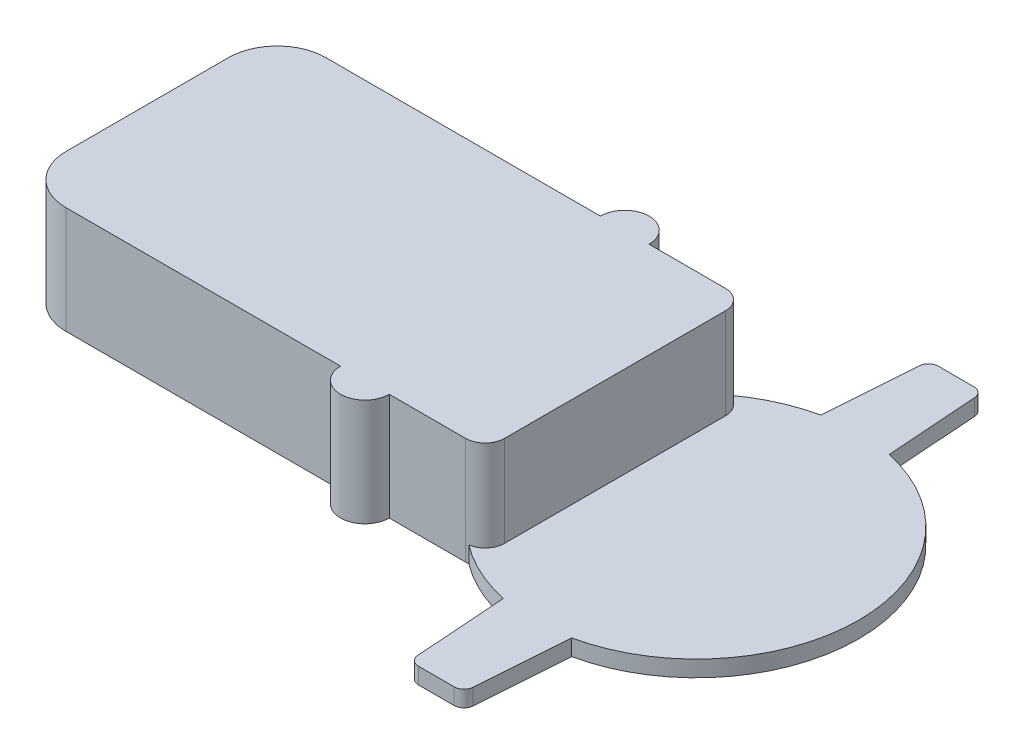
ISO-10303-21;
HEADER;
FILE_DESCRIPTION(('STEP AP214'),'2;1');
FILE_NAME('part.step','',(''),(''),'','','');
FILE_SCHEMA(('AUTOMOTIVE_DESIGN { 1 0 10303 214 1 1 1 1 }'));
ENDSEC;
DATA;
#1=APPLICATION_CONTEXT('core data for automotive mechanical design processes');
#2=APPLICATION_PROTOCOL_DEFINITION('international standard','automotive_design',2000,#1);
#3=PRODUCT_CONTEXT('',#1,'mechanical');
#4=PRODUCT('Part','Part','',(#3));
#5=PRODUCT_RELATED_PRODUCT_CATEGORY('part','',(#4));
#6=PRODUCT_DEFINITION_FORMATION('','',#4);
#7=PRODUCT_DEFINITION_CONTEXT('part definition',#1,'design');
#8=PRODUCT_DEFINITION('design','',#6,#7);
#9=PRODUCT_DEFINITION_SHAPE('','',#8);
#10=(LENGTH_UNIT() NAMED_UNIT(*) SI_UNIT(.MILLI.,.METRE.));
#11=(NAMED_UNIT(*) PLANE_ANGLE_UNIT() SI_UNIT($,.RADIAN.));
#12=(NAMED_UNIT(*) SI_UNIT($,.STERADIAN.) SOLID_ANGLE_UNIT());
#13=UNCERTAINTY_MEASURE_WITH_UNIT(LENGTH_MEASURE(1.E-05),#10,'distance_accuracy_value','');
#14=(GEOMETRIC_REPRESENTATION_CONTEXT(3) GLOBAL_UNCERTAINTY_ASSIGNED_CONTEXT((#13)) GLOBAL_UNIT_ASSIGNED_CONTEXT((#10,
#11,#12)) REPRESENTATION_CONTEXT('',''));
#15=CARTESIAN_POINT('',(0.,0.,0.));
#16=DIRECTION('',(0.,0.,1.));
#17=DIRECTION('',(1.,0.,0.));
#18=AXIS2_PLACEMENT_3D('',#15,#16,#17);
#19=CARTESIAN_POINT('',(0.,5.,0.));
#20=DIRECTION('',(0.,-1.,0.));
#21=DIRECTION('',(0.,0.,-1.));
#22=AXIS2_PLACEMENT_3D('',#19,#20,#21);
#23=CYLINDRICAL_SURFACE('',#22,50.);
#24=DIRECTION('',(0.,-1.,0.));
#25=VECTOR('',#24,1.);
#26=CARTESIAN_POINT('',(-30.0919312602184,2.5,39.9308862039185));
#27=LINE('',#26,#25);
#28=CARTESIAN_POINT('',(-30.0919312602184,0.,39.9308862039185));
#29=VERTEX_POINT('',#28);
#30=CARTESIAN_POINT('',(-30.0919312602184,5.,39.9308862039185));
#31=VERTEX_POINT('',#30);
#32=EDGE_CURVE('E313',#29,#31,#27,.F.);
#33=ORIENTED_EDGE('',*,*,#32,.F.);
#34=CARTESIAN_POINT('',(0.,0.,0.));
#35=DIRECTION('',(0.,1.,0.));
#36=DIRECTION('',(0.,0.,1.));
#37=AXIS2_PLACEMENT_3D('',#34,#35,#36);
#38=CIRCLE('',#37,50.);
#39=CARTESIAN_POINT('',(-10.5,0.,48.8850692952357));
#40=VERTEX_POINT('',#39);
#41=EDGE_CURVE('E182',#29,#40,#38,.T.);
#42=ORIENTED_EDGE('',*,*,#41,.T.);
#43=DIRECTION('',(0.,-1.,0.));
#44=VECTOR('',#43,1.);
#45=CARTESIAN_POINT('',(-10.5,5.,48.8850692952357));
#46=LINE('',#45,#44);
#47=CARTESIAN_POINT('',(-10.5,5.,48.8850692952357));
#48=VERTEX_POINT('',#47);
#49=EDGE_CURVE('E11',#48,#40,#46,.T.);
#50=ORIENTED_EDGE('',*,*,#49,.F.);
#51=CARTESIAN_POINT('',(0.,5.,0.));
#52=DIRECTION('',(0.,1.,0.));
#53=DIRECTION('',(0.,0.,1.));
#54=AXIS2_PLACEMENT_3D('',#51,#52,#53);
#55=CIRCLE('',#54,50.);
#56=EDGE_CURVE('E116',#31,#48,#55,.T.);
#57=ORIENTED_EDGE('',*,*,#56,.F.);
#58=EDGE_LOOP('',(#33,#42,#50,#57));
#59=FACE_BOUND('',#58,.T.);
#60=ADVANCED_FACE('F39',(#59),#23,.T.);
#61=DIRECTION('',(0.,-1.,0.));
#62=VECTOR('',#61,1.);
#63=CARTESIAN_POINT('',(-30.0919312602184,2.5,-39.9308862039185));
#64=LINE('',#63,#62);
#65=CARTESIAN_POINT('',(-30.0919312602184,5.,-39.9308862039185));
#66=VERTEX_POINT('',#65);
#67=CARTESIAN_POINT('',(-30.0919312602184,0.,-39.9308862039185));
#68=VERTEX_POINT('',#67);
#69=EDGE_CURVE('E304',#66,#68,#64,.T.);
#70=ORIENTED_EDGE('',*,*,#69,.F.);
#71=CARTESIAN_POINT('',(-10.5,5.,-48.8850692952357));
#72=VERTEX_POINT('',#71);
#73=EDGE_CURVE('E300',#72,#66,#55,.T.);
#74=ORIENTED_EDGE('',*,*,#73,.F.);
#75=DIRECTION('',(0.,-1.,0.));
#76=VECTOR('',#75,1.);
#77=CARTESIAN_POINT('',(-10.5,5.,-48.8850692952357));
#78=LINE('',#77,#76);
#79=CARTESIAN_POINT('',(-10.5,0.,-48.8850692952357));
#80=VERTEX_POINT('',#79);
#81=EDGE_CURVE('E173',#72,#80,#78,.T.);
#82=ORIENTED_EDGE('',*,*,#81,.T.);
#83=EDGE_CURVE('E177',#80,#68,#38,.T.);
#84=ORIENTED_EDGE('',*,*,#83,.T.);
#85=EDGE_LOOP('',(#70,#74,#82,#84));
#86=FACE_BOUND('',#85,.T.);
#87=ADVANCED_FACE('F301',(#86),#23,.T.);
#88=CARTESIAN_POINT('',(-10.5,5.,48.8850692952357));
#89=DIRECTION('',(0.997516680584559,0.,-0.0704306180262745));
#90=DIRECTION('',(-0.0704306180262745,0.,-0.997516680584559));
#91=AXIS2_PLACEMENT_3D('',#88,#89,#90);
#92=PLANE('',#91);
#93=DIRECTION('',(0.0704306180262745,0.,0.997516680584559));
#94=VECTOR('',#93,1.);
#95=CARTESIAN_POINT('',(-10.5,0.,48.8850692952357));
#96=LINE('',#95,#94);
#97=CARTESIAN_POINT('',(-8.49999999999999,0.,77.2112918540788));
#98=VERTEX_POINT('',#97);
#99=EDGE_CURVE('E181',#40,#98,#96,.T.);
#100=ORIENTED_EDGE('',*,*,#99,.T.);
#101=DIRECTION('',(0.,-1.,0.));
#102=VECTOR('',#101,1.);
#103=CARTESIAN_POINT('',(-8.49999999999999,5.,77.2112918540788));
#104=LINE('',#103,#102);
#105=CARTESIAN_POINT('',(-8.49999999999999,5.,77.2112918540788));
#106=VERTEX_POINT('',#105);
#107=EDGE_CURVE('E47',#106,#98,#104,.T.);
#108=ORIENTED_EDGE('',*,*,#107,.F.);
#109=DIRECTION('',(0.0704306180262745,0.,0.997516680584559));
#110=VECTOR('',#109,1.);
#111=CARTESIAN_POINT('',(-10.5,5.,48.8850692952357));
#112=LINE('',#111,#110);
#113=EDGE_CURVE('E307',#48,#106,#112,.T.);
#114=ORIENTED_EDGE('',*,*,#113,.F.);
#115=ORIENTED_EDGE('',*,*,#49,.T.);
#116=EDGE_LOOP('',(#100,#108,#114,#115));
#117=FACE_BOUND('',#116,.T.);
#118=ADVANCED_FACE('F317',(#117),#92,.F.);
#119=CARTESIAN_POINT('',(-5.50744995824632,5.,77.));
#120=DIRECTION('',(0.,-1.,0.));
#121=DIRECTION('',(0.,0.,-1.));
#122=AXIS2_PLACEMENT_3D('',#119,#120,#121);
#123=CYLINDRICAL_SURFACE('',#122,2.99999999999999);
#124=CARTESIAN_POINT('',(-5.50744995824632,0.,77.));
#125=DIRECTION('',(0.,1.,0.));
#126=DIRECTION('',(0.,0.,1.));
#127=AXIS2_PLACEMENT_3D('',#124,#125,#126);
#128=CIRCLE('',#127,2.99999999999999);
#129=CARTESIAN_POINT('',(-5.50744995824632,0.,80.));
#130=VERTEX_POINT('',#129);
#131=EDGE_CURVE('E185',#98,#130,#128,.T.);
#132=ORIENTED_EDGE('',*,*,#131,.T.);
#133=DIRECTION('',(0.,-1.,0.));
#134=VECTOR('',#133,1.);
#135=CARTESIAN_POINT('',(-5.50744995824632,5.,80.));
#136=LINE('',#135,#134);
#137=CARTESIAN_POINT('',(-5.50744995824632,5.,80.));
#138=VERTEX_POINT('',#137);
#139=EDGE_CURVE('E239',#138,#130,#136,.T.);
#140=ORIENTED_EDGE('',*,*,#139,.F.);
#141=CARTESIAN_POINT('',(-5.50744995824632,5.,77.));
#142=DIRECTION('',(0.,1.,0.));
#143=DIRECTION('',(0.,0.,1.));
#144=AXIS2_PLACEMENT_3D('',#141,#142,#143);
#145=CIRCLE('',#144,2.99999999999999);
#146=EDGE_CURVE('E250',#106,#138,#145,.T.);
#147=ORIENTED_EDGE('',*,*,#146,.F.);
#148=ORIENTED_EDGE('',*,*,#107,.T.);
#149=EDGE_LOOP('',(#132,#140,#147,#148));
#150=FACE_BOUND('',#149,.T.);
#151=ADVANCED_FACE('F248',(#150),#123,.T.);
#152=CARTESIAN_POINT('',(-5.50744995824632,5.,80.));
#153=DIRECTION('',(0.,0.,-1.));
#154=DIRECTION('',(-1.,0.,0.));
#155=AXIS2_PLACEMENT_3D('',#152,#153,#154);
#156=PLANE('',#155);
#157=DIRECTION('',(1.,0.,0.));
#158=VECTOR('',#157,1.);
#159=CARTESIAN_POINT('',(-5.50744995824632,0.,80.));
#160=LINE('',#159,#158);
#161=CARTESIAN_POINT('',(5.50744995824632,0.,80.));
#162=VERTEX_POINT('',#161);
#163=EDGE_CURVE('E188',#130,#162,#160,.T.);
#164=ORIENTED_EDGE('',*,*,#163,.T.);
#165=DIRECTION('',(0.,-1.,0.));
#166=VECTOR('',#165,1.);
#167=CARTESIAN_POINT('',(5.50744995824632,5.,80.));
#168=LINE('',#167,#166);
#169=CARTESIAN_POINT('',(5.50744995824632,5.,80.));
#170=VERTEX_POINT('',#169);
#171=EDGE_CURVE('E235',#170,#162,#168,.T.);
#172=ORIENTED_EDGE('',*,*,#171,.F.);
#173=DIRECTION('',(1.,0.,0.));
#174=VECTOR('',#173,1.);
#175=CARTESIAN_POINT('',(-5.50744995824632,5.,80.));
#176=LINE('',#175,#174);
#177=EDGE_CURVE('E271',#138,#170,#176,.T.);
#178=ORIENTED_EDGE('',*,*,#177,.F.);
#179=ORIENTED_EDGE('',*,*,#139,.T.);
#180=EDGE_LOOP('',(#164,#172,#178,#179));
#181=FACE_BOUND('',#180,.T.);
#182=ADVANCED_FACE('F261',(#181),#156,.F.);
#183=CARTESIAN_POINT('',(5.50744995824632,5.,77.));
#184=DIRECTION('',(0.,-1.,0.));
#185=DIRECTION('',(0.,0.,-1.));
#186=AXIS2_PLACEMENT_3D('',#183,#184,#185);
#187=CYLINDRICAL_SURFACE('',#186,2.99999999999999);
#188=CARTESIAN_POINT('',(5.50744995824632,0.,77.));
#189=DIRECTION('',(0.,1.,0.));
#190=DIRECTION('',(0.,0.,-1.));
#191=AXIS2_PLACEMENT_3D('',#188,#189,#190);
#192=CIRCLE('',#191,2.99999999999999);
#193=CARTESIAN_POINT('',(8.5,0.,77.2112918540788));
#194=VERTEX_POINT('',#193);
#195=EDGE_CURVE('E191',#162,#194,#192,.T.);
#196=ORIENTED_EDGE('',*,*,#195,.T.);
#197=DIRECTION('',(0.,-1.,0.));
#198=VECTOR('',#197,1.);
#199=CARTESIAN_POINT('',(8.5,5.,77.2112918540788));
#200=LINE('',#199,#198);
#201=CARTESIAN_POINT('',(8.5,5.,77.2112918540788));
#202=VERTEX_POINT('',#201);
#203=EDGE_CURVE('E231',#202,#194,#200,.T.);
#204=ORIENTED_EDGE('',*,*,#203,.F.);
#205=CARTESIAN_POINT('',(5.50744995824632,5.,77.));
#206=DIRECTION('',(0.,1.,0.));
#207=DIRECTION('',(0.,0.,-1.));
#208=AXIS2_PLACEMENT_3D('',#205,#206,#207);
#209=CIRCLE('',#208,2.99999999999999);
#210=EDGE_CURVE('E267',#170,#202,#209,.T.);
#211=ORIENTED_EDGE('',*,*,#210,.F.);
#212=ORIENTED_EDGE('',*,*,#171,.T.);
#213=EDGE_LOOP('',(#196,#204,#211,#212));
#214=FACE_BOUND('',#213,.T.);
#215=ADVANCED_FACE('F265',(#214),#187,.T.);
#216=CARTESIAN_POINT('',(10.5,5.,48.8850692952357));
#217=DIRECTION('',(-0.997516680584559,0.,-0.0704306180262745));
#218=DIRECTION('',(-0.0704306180262745,0.,0.997516680584559));
#219=AXIS2_PLACEMENT_3D('',#216,#217,#218);
#220=PLANE('',#219);
#221=DIRECTION('',(0.0704306180262745,0.,-0.997516680584559));
#222=VECTOR('',#221,1.);
#223=CARTESIAN_POINT('',(10.5,0.,48.8850692952357));
#224=LINE('',#223,#222);
#225=CARTESIAN_POINT('',(10.5,0.,48.8850692952357));
#226=VERTEX_POINT('',#225);
#227=EDGE_CURVE('E194',#194,#226,#224,.T.);
#228=ORIENTED_EDGE('',*,*,#227,.T.);
#229=DIRECTION('',(0.,-1.,0.));
#230=VECTOR('',#229,1.);
#231=CARTESIAN_POINT('',(10.5,5.,48.8850692952357));
#232=LINE('',#231,#230);
#233=CARTESIAN_POINT('',(10.5,5.,48.8850692952357));
#234=VERTEX_POINT('',#233);
#235=EDGE_CURVE('E227',#234,#226,#232,.T.);
#236=ORIENTED_EDGE('',*,*,#235,.F.);
#237=DIRECTION('',(0.0704306180262745,0.,-0.997516680584559));
#238=VECTOR('',#237,1.);
#239=CARTESIAN_POINT('',(10.5,5.,48.8850692952357));
#240=LINE('',#239,#238);
#241=EDGE_CURVE('E270',#202,#234,#240,.T.);
#242=ORIENTED_EDGE('',*,*,#241,.F.);
#243=ORIENTED_EDGE('',*,*,#203,.T.);
#244=EDGE_LOOP('',(#228,#236,#242,#243));
#245=FACE_BOUND('',#244,.T.);
#246=ADVANCED_FACE('F581',(#245),#220,.F.);
#247=CARTESIAN_POINT('',(0.,5.,0.));
#248=DIRECTION('',(0.,-1.,0.));
#249=DIRECTION('',(0.,0.,-1.));
#250=AXIS2_PLACEMENT_3D('',#247,#248,#249);
#251=CYLINDRICAL_SURFACE('',#250,50.);
#252=CARTESIAN_POINT('',(0.,0.,0.));
#253=DIRECTION('',(0.,1.,0.));
#254=DIRECTION('',(0.,0.,1.));
#255=AXIS2_PLACEMENT_3D('',#252,#253,#254);
#256=CIRCLE('',#255,50.);
#257=CARTESIAN_POINT('',(10.5,0.,-48.8850692952357));
#258=VERTEX_POINT('',#257);
#259=EDGE_CURVE('E197',#226,#258,#256,.T.);
#260=ORIENTED_EDGE('',*,*,#259,.T.);
#261=DIRECTION('',(0.,-1.,0.));
#262=VECTOR('',#261,1.);
#263=CARTESIAN_POINT('',(10.5,5.,-48.8850692952357));
#264=LINE('',#263,#262);
#265=CARTESIAN_POINT('',(10.5,5.,-48.8850692952357));
#266=VERTEX_POINT('',#265);
#267=EDGE_CURVE('E223',#266,#258,#264,.T.);
#268=ORIENTED_EDGE('',*,*,#267,.F.);
#269=CARTESIAN_POINT('',(0.,5.,0.));
#270=DIRECTION('',(0.,1.,0.));
#271=DIRECTION('',(0.,0.,1.));
#272=AXIS2_PLACEMENT_3D('',#269,#270,#271);
#273=CIRCLE('',#272,50.);
#274=EDGE_CURVE('E275',#234,#266,#273,.T.);
#275=ORIENTED_EDGE('',*,*,#274,.F.);
#276=ORIENTED_EDGE('',*,*,#235,.T.);
#277=EDGE_LOOP('',(#260,#268,#275,#276));
#278=FACE_BOUND('',#277,.T.);
#279=ADVANCED_FACE('F584',(#278),#251,.T.);
#280=CARTESIAN_POINT('',(10.5,5.,-48.8850692952357));
#281=DIRECTION('',(-0.997516680584559,0.,0.0704306180262745));
#282=DIRECTION('',(0.0704306180262745,0.,0.997516680584559));
#283=AXIS2_PLACEMENT_3D('',#280,#281,#282);
#284=PLANE('',#283);
#285=DIRECTION('',(-0.0704306180262745,0.,-0.997516680584559));
#286=VECTOR('',#285,1.);
#287=CARTESIAN_POINT('',(10.5,0.,-48.8850692952357));
#288=LINE('',#287,#286);
#289=CARTESIAN_POINT('',(8.49999999999999,0.,-77.2112918540788));
#290=VERTEX_POINT('',#289);
#291=EDGE_CURVE('E200',#258,#290,#288,.T.);
#292=ORIENTED_EDGE('',*,*,#291,.T.);
#293=DIRECTION('',(0.,-1.,0.));
#294=VECTOR('',#293,1.);
#295=CARTESIAN_POINT('',(8.49999999999999,5.,-77.2112918540788));
#296=LINE('',#295,#294);
#297=CARTESIAN_POINT('',(8.49999999999999,5.,-77.2112918540788));
#298=VERTEX_POINT('',#297);
#299=EDGE_CURVE('E219',#298,#290,#296,.T.);
#300=ORIENTED_EDGE('',*,*,#299,.F.);
#301=DIRECTION('',(-0.0704306180262745,0.,-0.997516680584559));
#302=VECTOR('',#301,1.);
#303=CARTESIAN_POINT('',(10.5,5.,-48.8850692952357));
#304=LINE('',#303,#302);
#305=EDGE_CURVE('E282',#266,#298,#304,.T.);
#306=ORIENTED_EDGE('',*,*,#305,.F.);
#307=ORIENTED_EDGE('',*,*,#267,.T.);
#308=EDGE_LOOP('',(#292,#300,#306,#307));
#309=FACE_BOUND('',#308,.T.);
#310=ADVANCED_FACE('F290',(#309),#284,.F.);
#311=CARTESIAN_POINT('',(5.50744995824632,5.,-77.));
#312=DIRECTION('',(0.,-1.,0.));
#313=DIRECTION('',(0.,0.,-1.));
#314=AXIS2_PLACEMENT_3D('',#311,#312,#313);
#315=CYLINDRICAL_SURFACE('',#314,2.99999999999999);
#316=CARTESIAN_POINT('',(5.50744995824632,0.,-77.));
#317=DIRECTION('',(0.,1.,0.));
#318=DIRECTION('',(0.,0.,1.));
#319=AXIS2_PLACEMENT_3D('',#316,#317,#318);
#320=CIRCLE('',#319,2.99999999999999);
#321=CARTESIAN_POINT('',(5.50744995824632,0.,-80.));
#322=VERTEX_POINT('',#321);
#323=EDGE_CURVE('E203',#290,#322,#320,.T.);
#324=ORIENTED_EDGE('',*,*,#323,.T.);
#325=DIRECTION('',(0.,-1.,0.));
#326=VECTOR('',#325,1.);
#327=CARTESIAN_POINT('',(5.50744995824632,5.,-80.));
#328=LINE('',#327,#326);
#329=CARTESIAN_POINT('',(5.50744995824632,5.,-80.));
#330=VERTEX_POINT('',#329);
#331=EDGE_CURVE('E166',#330,#322,#328,.T.);
#332=ORIENTED_EDGE('',*,*,#331,.F.);
#333=CARTESIAN_POINT('',(5.50744995824632,5.,-77.));
#334=DIRECTION('',(0.,1.,0.));
#335=DIRECTION('',(0.,0.,1.));
#336=AXIS2_PLACEMENT_3D('',#333,#334,#335);
#337=CIRCLE('',#336,2.99999999999999);
#338=EDGE_CURVE('E152',#298,#330,#337,.T.);
#339=ORIENTED_EDGE('',*,*,#338,.F.);
#340=ORIENTED_EDGE('',*,*,#299,.T.);
#341=EDGE_LOOP('',(#324,#332,#339,#340));
#342=FACE_BOUND('',#341,.T.);
#343=ADVANCED_FACE('F294',(#342),#315,.T.);
#344=CARTESIAN_POINT('',(-5.50744995824632,5.,-80.));
#345=DIRECTION('',(0.,0.,1.));
#346=DIRECTION('',(1.,0.,0.));
#347=AXIS2_PLACEMENT_3D('',#344,#345,#346);
#348=PLANE('',#347);
#349=DIRECTION('',(-1.,0.,0.));
#350=VECTOR('',#349,1.);
#351=CARTESIAN_POINT('',(-5.50744995824632,0.,-80.));
#352=LINE('',#351,#350);
#353=CARTESIAN_POINT('',(-5.50744995824632,0.,-80.));
#354=VERTEX_POINT('',#353);
#355=EDGE_CURVE('E162',#322,#354,#352,.T.);
#356=ORIENTED_EDGE('',*,*,#355,.T.);
#357=DIRECTION('',(0.,-1.,0.));
#358=VECTOR('',#357,1.);
#359=CARTESIAN_POINT('',(-5.50744995824632,5.,-80.));
#360=LINE('',#359,#358);
#361=CARTESIAN_POINT('',(-5.50744995824632,5.,-80.));
#362=VERTEX_POINT('',#361);
#363=EDGE_CURVE('E159',#362,#354,#360,.T.);
#364=ORIENTED_EDGE('',*,*,#363,.F.);
#365=DIRECTION('',(-1.,0.,0.));
#366=VECTOR('',#365,1.);
#367=CARTESIAN_POINT('',(-5.50744995824632,5.,-80.));
#368=LINE('',#367,#366);
#369=EDGE_CURVE('E144',#330,#362,#368,.T.);
#370=ORIENTED_EDGE('',*,*,#369,.F.);
#371=ORIENTED_EDGE('',*,*,#331,.T.);
#372=EDGE_LOOP('',(#356,#364,#370,#371));
#373=FACE_BOUND('',#372,.T.);
#374=ADVANCED_FACE('F160',(#373),#348,.F.);
#375=CARTESIAN_POINT('',(-5.50744995824632,5.,-77.));
#376=DIRECTION('',(0.,-1.,0.));
#377=DIRECTION('',(0.,0.,-1.));
#378=AXIS2_PLACEMENT_3D('',#375,#376,#377);
#379=CYLINDRICAL_SURFACE('',#378,2.99999999999999);
#380=CARTESIAN_POINT('',(-5.50744995824632,0.,-77.));
#381=DIRECTION('',(0.,1.,0.));
#382=DIRECTION('',(0.,0.,-1.));
#383=AXIS2_PLACEMENT_3D('',#380,#381,#382);
#384=CIRCLE('',#383,2.99999999999999);
#385=CARTESIAN_POINT('',(-8.5,0.,-77.2112918540788));
#386=VERTEX_POINT('',#385);
#387=EDGE_CURVE('E208',#354,#386,#384,.T.);
#388=ORIENTED_EDGE('',*,*,#387,.T.);
#389=DIRECTION('',(0.,-1.,0.));
#390=VECTOR('',#389,1.);
#391=CARTESIAN_POINT('',(-8.5,5.,-77.2112918540788));
#392=LINE('',#391,#390);
#393=CARTESIAN_POINT('',(-8.5,5.,-77.2112918540788));
#394=VERTEX_POINT('',#393);
#395=EDGE_CURVE('E167',#394,#386,#392,.T.);
#396=ORIENTED_EDGE('',*,*,#395,.F.);
#397=CARTESIAN_POINT('',(-5.50744995824632,5.,-77.));
#398=DIRECTION('',(0.,1.,0.));
#399=DIRECTION('',(0.,0.,-1.));
#400=AXIS2_PLACEMENT_3D('',#397,#398,#399);
#401=CIRCLE('',#400,2.99999999999999);
#402=EDGE_CURVE('E149',#362,#394,#401,.T.);
#403=ORIENTED_EDGE('',*,*,#402,.F.);
#404=ORIENTED_EDGE('',*,*,#363,.T.);
#405=EDGE_LOOP('',(#388,#396,#403,#404));
#406=FACE_BOUND('',#405,.T.);
#407=ADVANCED_FACE('F169',(#406),#379,.T.);
#408=CARTESIAN_POINT('',(-10.5,5.,-48.8850692952357));
#409=DIRECTION('',(0.997516680584559,0.,0.0704306180262745));
#410=DIRECTION('',(0.0704306180262745,0.,-0.997516680584559));
#411=AXIS2_PLACEMENT_3D('',#408,#409,#410);
#412=PLANE('',#411);
#413=DIRECTION('',(-0.0704306180262745,0.,0.997516680584559));
#414=VECTOR('',#413,1.);
#415=CARTESIAN_POINT('',(-10.5,0.,-48.8850692952357));
#416=LINE('',#415,#414);
#417=EDGE_CURVE('E108',#386,#80,#416,.T.);
#418=ORIENTED_EDGE('',*,*,#417,.T.);
#419=ORIENTED_EDGE('',*,*,#81,.F.);
#420=DIRECTION('',(-0.0704306180262745,0.,0.997516680584559));
#421=VECTOR('',#420,1.);
#422=CARTESIAN_POINT('',(-10.5,5.,-48.8850692952357));
#423=LINE('',#422,#421);
#424=EDGE_CURVE('E63',#394,#72,#423,.T.);
#425=ORIENTED_EDGE('',*,*,#424,.F.);
#426=ORIENTED_EDGE('',*,*,#395,.T.);
#427=EDGE_LOOP('',(#418,#419,#425,#426));
#428=FACE_BOUND('',#427,.T.);
#429=ADVANCED_FACE('F296',(#428),#412,.F.);
#430=CARTESIAN_POINT('',(0.,5.,0.));
#431=DIRECTION('',(0.,1.,0.));
#432=DIRECTION('',(0.,0.,1.));
#433=AXIS2_PLACEMENT_3D('',#430,#431,#432);
#434=PLANE('',#433);
#435=DIRECTION('',(0.,0.,1.));
#436=VECTOR('',#435,1.);
#437=CARTESIAN_POINT('',(-25.,5.,0.));
#438=LINE('',#437,#436);
#439=CARTESIAN_POINT('',(-25.,5.,-34.));
#440=VERTEX_POINT('',#439);
#441=CARTESIAN_POINT('',(-25.,5.,34.));
#442=VERTEX_POINT('',#441);
#443=EDGE_CURVE('E330',#440,#442,#438,.T.);
#444=ORIENTED_EDGE('',*,*,#443,.T.);
#445=CARTESIAN_POINT('',(-31.,5.,34.));
#446=DIRECTION('',(0.,1.,0.));
#447=DIRECTION('',(0.,0.,1.));
#448=AXIS2_PLACEMENT_3D('',#445,#446,#447);
#449=CIRCLE('',#448,6.);
#450=EDGE_CURVE('E325',#442,#31,#449,.F.);
#451=ORIENTED_EDGE('',*,*,#450,.T.);
#452=ORIENTED_EDGE('',*,*,#56,.T.);
#453=ORIENTED_EDGE('',*,*,#113,.T.);
#454=ORIENTED_EDGE('',*,*,#146,.T.);
#455=ORIENTED_EDGE('',*,*,#177,.T.);
#456=ORIENTED_EDGE('',*,*,#210,.T.);
#457=ORIENTED_EDGE('',*,*,#241,.T.);
#458=ORIENTED_EDGE('',*,*,#274,.T.);
#459=ORIENTED_EDGE('',*,*,#305,.T.);
#460=ORIENTED_EDGE('',*,*,#338,.T.);
#461=ORIENTED_EDGE('',*,*,#369,.T.);
#462=ORIENTED_EDGE('',*,*,#402,.T.);
#463=ORIENTED_EDGE('',*,*,#424,.T.);
#464=ORIENTED_EDGE('',*,*,#73,.T.);
#465=CARTESIAN_POINT('',(-31.,5.,-34.));
#466=DIRECTION('',(0.,1.,0.));
#467=DIRECTION('',(0.,0.,1.));
#468=AXIS2_PLACEMENT_3D('',#465,#466,#467);
#469=CIRCLE('',#468,6.);
#470=EDGE_CURVE('E336',#66,#440,#469,.F.);
#471=ORIENTED_EDGE('',*,*,#470,.T.);
#472=EDGE_LOOP('',(#444,#451,#452,#453,#454,#455,#456,#457,#458,#459,#460,#461,#462,#463,#464,#471));
#473=FACE_BOUND('',#472,.T.);
#474=ADVANCED_FACE('F147',(#473),#434,.T.);
#475=CARTESIAN_POINT('',(0.,0.,0.));
#476=DIRECTION('',(0.,1.,0.));
#477=DIRECTION('',(0.,0.,1.));
#478=AXIS2_PLACEMENT_3D('',#475,#476,#477);
#479=PLANE('',#478);
#480=ORIENTED_EDGE('',*,*,#41,.F.);
#481=CARTESIAN_POINT('',(-31.,0.,34.));
#482=DIRECTION('',(0.,1.,0.));
#483=DIRECTION('',(0.,0.,1.));
#484=AXIS2_PLACEMENT_3D('',#481,#482,#483);
#485=CIRCLE('',#484,6.);
#486=CARTESIAN_POINT('',(-31.0000000000001,0.,40.));
#487=VERTEX_POINT('',#486);
#488=EDGE_CURVE('E395',#487,#29,#485,.T.);
#489=ORIENTED_EDGE('',*,*,#488,.F.);
#490=DIRECTION('',(1.,0.,0.));
#491=VECTOR('',#490,1.);
#492=CARTESIAN_POINT('',(-54.5,0.,40.));
#493=LINE('',#492,#491);
#494=CARTESIAN_POINT('',(-54.5,0.,40.));
#495=VERTEX_POINT('',#494);
#496=EDGE_CURVE('E398',#495,#487,#493,.T.);
#497=ORIENTED_EDGE('',*,*,#496,.F.);
#498=CARTESIAN_POINT('',(-62.,0.,40.));
#499=DIRECTION('',(0.,1.,0.));
#500=DIRECTION('',(0.,0.,-1.));
#501=AXIS2_PLACEMENT_3D('',#498,#499,#500);
#502=CIRCLE('',#501,7.5);
#503=CARTESIAN_POINT('',(-69.5,0.,40.));
#504=VERTEX_POINT('',#503);
#505=EDGE_CURVE('E402',#504,#495,#502,.T.);
#506=ORIENTED_EDGE('',*,*,#505,.F.);
#507=DIRECTION('',(1.,0.,0.));
#508=VECTOR('',#507,1.);
#509=CARTESIAN_POINT('',(-154.,0.,40.));
#510=LINE('',#509,#508);
#511=CARTESIAN_POINT('',(-154.,0.,40.));
#512=VERTEX_POINT('',#511);
#513=EDGE_CURVE('E406',#512,#504,#510,.T.);
#514=ORIENTED_EDGE('',*,*,#513,.F.);
#515=CARTESIAN_POINT('',(-154.,0.,25.));
#516=DIRECTION('',(0.,1.,0.));
#517=DIRECTION('',(0.,0.,-1.));
#518=AXIS2_PLACEMENT_3D('',#515,#516,#517);
#519=CIRCLE('',#518,15.);
#520=CARTESIAN_POINT('',(-169.,0.,24.9999999999999));
#521=VERTEX_POINT('',#520);
#522=EDGE_CURVE('E410',#521,#512,#519,.T.);
#523=ORIENTED_EDGE('',*,*,#522,.F.);
#524=DIRECTION('',(0.,0.,1.));
#525=VECTOR('',#524,1.);
#526=CARTESIAN_POINT('',(-169.,0.,24.9999999999999));
#527=LINE('',#526,#525);
#528=CARTESIAN_POINT('',(-169.,0.,-24.9999999999999));
#529=VERTEX_POINT('',#528);
#530=EDGE_CURVE('E414',#529,#521,#527,.T.);
#531=ORIENTED_EDGE('',*,*,#530,.F.);
#532=CARTESIAN_POINT('',(-154.,0.,-25.));
#533=DIRECTION('',(0.,1.,0.));
#534=DIRECTION('',(0.,0.,-1.));
#535=AXIS2_PLACEMENT_3D('',#532,#533,#534);
#536=CIRCLE('',#535,15.);
#537=CARTESIAN_POINT('',(-154.,0.,-40.));
#538=VERTEX_POINT('',#537);
#539=EDGE_CURVE('E418',#538,#529,#536,.T.);
#540=ORIENTED_EDGE('',*,*,#539,.F.);
#541=DIRECTION('',(-1.,0.,0.));
#542=VECTOR('',#541,1.);
#543=CARTESIAN_POINT('',(-154.,0.,-40.));
#544=LINE('',#543,#542);
#545=CARTESIAN_POINT('',(-69.5,0.,-40.));
#546=VERTEX_POINT('',#545);
#547=EDGE_CURVE('E422',#546,#538,#544,.T.);
#548=ORIENTED_EDGE('',*,*,#547,.F.);
#549=CARTESIAN_POINT('',(-62.,0.,-40.));
#550=DIRECTION('',(0.,1.,0.));
#551=DIRECTION('',(0.,0.,1.));
#552=AXIS2_PLACEMENT_3D('',#549,#550,#551);
#553=CIRCLE('',#552,7.5);
#554=CARTESIAN_POINT('',(-54.5,0.,-40.));
#555=VERTEX_POINT('',#554);
#556=EDGE_CURVE('E426',#555,#546,#553,.T.);
#557=ORIENTED_EDGE('',*,*,#556,.F.);
#558=DIRECTION('',(-1.,0.,0.));
#559=VECTOR('',#558,1.);
#560=CARTESIAN_POINT('',(-54.5,0.,-40.));
#561=LINE('',#560,#559);
#562=CARTESIAN_POINT('',(-31.0000000000001,0.,-40.));
#563=VERTEX_POINT('',#562);
#564=EDGE_CURVE('E386',#563,#555,#561,.T.);
#565=ORIENTED_EDGE('',*,*,#564,.F.);
#566=CARTESIAN_POINT('',(-31.,0.,-34.));
#567=DIRECTION('',(0.,1.,0.));
#568=DIRECTION('',(0.,0.,-1.));
#569=AXIS2_PLACEMENT_3D('',#566,#567,#568);
#570=CIRCLE('',#569,6.);
#571=EDGE_CURVE('E391',#68,#563,#570,.T.);
#572=ORIENTED_EDGE('',*,*,#571,.F.);
#573=ORIENTED_EDGE('',*,*,#83,.F.);
#574=ORIENTED_EDGE('',*,*,#417,.F.);
#575=ORIENTED_EDGE('',*,*,#387,.F.);
#576=ORIENTED_EDGE('',*,*,#355,.F.);
#577=ORIENTED_EDGE('',*,*,#323,.F.);
#578=ORIENTED_EDGE('',*,*,#291,.F.);
#579=ORIENTED_EDGE('',*,*,#259,.F.);
#580=ORIENTED_EDGE('',*,*,#227,.F.);
#581=ORIENTED_EDGE('',*,*,#195,.F.);
#582=ORIENTED_EDGE('',*,*,#163,.F.);
#583=ORIENTED_EDGE('',*,*,#131,.F.);
#584=ORIENTED_EDGE('',*,*,#99,.F.);
#585=EDGE_LOOP('',(#480,#489,#497,#506,#514,#523,#531,#540,#548,#557,#565,#572,#573,#574,#575,
#576,#577,#578,#579,#580,#581,#582,#583,#584));
#586=FACE_BOUND('',#585,.T.);
#587=ADVANCED_FACE('F256',(#586),#479,.F.);
#588=CARTESIAN_POINT('',(-31.,33.,34.));
#589=DIRECTION('',(0.,-1.,0.));
#590=DIRECTION('',(0.,0.,-1.));
#591=AXIS2_PLACEMENT_3D('',#588,#589,#590);
#592=CYLINDRICAL_SURFACE('',#591,6.);
#593=ORIENTED_EDGE('',*,*,#488,.T.);
#594=ORIENTED_EDGE('',*,*,#32,.T.);
#595=ORIENTED_EDGE('',*,*,#450,.F.);
#596=DIRECTION('',(0.,-1.,0.));
#597=VECTOR('',#596,1.);
#598=CARTESIAN_POINT('',(-25.,33.,34.));
#599=LINE('',#598,#597);
#600=CARTESIAN_POINT('',(-25.,33.,34.));
#601=VERTEX_POINT('',#600);
#602=EDGE_CURVE('E371',#601,#442,#599,.T.);
#603=ORIENTED_EDGE('',*,*,#602,.F.);
#604=CARTESIAN_POINT('',(-31.,33.,34.));
#605=DIRECTION('',(0.,1.,0.));
#606=DIRECTION('',(0.,0.,1.));
#607=AXIS2_PLACEMENT_3D('',#604,#605,#606);
#608=CIRCLE('',#607,6.);
#609=CARTESIAN_POINT('',(-31.0000000000001,33.,40.));
#610=VERTEX_POINT('',#609);
#611=EDGE_CURVE('E441',#610,#601,#608,.T.);
#612=ORIENTED_EDGE('',*,*,#611,.F.);
#613=DIRECTION('',(0.,-1.,0.));
#614=VECTOR('',#613,1.);
#615=CARTESIAN_POINT('',(-31.0000000000001,33.,40.));
#616=LINE('',#615,#614);
#617=EDGE_CURVE('E367',#610,#487,#616,.T.);
#618=ORIENTED_EDGE('',*,*,#617,.T.);
#619=EDGE_LOOP('',(#593,#594,#595,#603,#612,#618));
#620=FACE_BOUND('',#619,.T.);
#621=ADVANCED_FACE('F521',(#620),#592,.T.);
#622=CARTESIAN_POINT('',(-31.,33.,-34.));
#623=DIRECTION('',(0.,-1.,0.));
#624=DIRECTION('',(0.,0.,-1.));
#625=AXIS2_PLACEMENT_3D('',#622,#623,#624);
#626=CYLINDRICAL_SURFACE('',#625,6.);
#627=ORIENTED_EDGE('',*,*,#470,.F.);
#628=ORIENTED_EDGE('',*,*,#69,.T.);
#629=ORIENTED_EDGE('',*,*,#571,.T.);
#630=DIRECTION('',(0.,-1.,0.));
#631=VECTOR('',#630,1.);
#632=CARTESIAN_POINT('',(-31.0000000000001,33.,-40.));
#633=LINE('',#632,#631);
#634=CARTESIAN_POINT('',(-31.0000000000001,33.,-40.));
#635=VERTEX_POINT('',#634);
#636=EDGE_CURVE('E377',#635,#563,#633,.T.);
#637=ORIENTED_EDGE('',*,*,#636,.F.);
#638=CARTESIAN_POINT('',(-31.,33.,-34.));
#639=DIRECTION('',(0.,1.,0.));
#640=DIRECTION('',(0.,0.,-1.));
#641=AXIS2_PLACEMENT_3D('',#638,#639,#640);
#642=CIRCLE('',#641,6.);
#643=CARTESIAN_POINT('',(-25.,33.,-34.));
#644=VERTEX_POINT('',#643);
#645=EDGE_CURVE('E433',#644,#635,#642,.T.);
#646=ORIENTED_EDGE('',*,*,#645,.F.);
#647=DIRECTION('',(0.,-1.,0.));
#648=VECTOR('',#647,1.);
#649=CARTESIAN_POINT('',(-25.,33.,-34.));
#650=LINE('',#649,#648);
#651=EDGE_CURVE('E54',#644,#440,#650,.T.);
#652=ORIENTED_EDGE('',*,*,#651,.T.);
#653=EDGE_LOOP('',(#627,#628,#629,#637,#646,#652));
#654=FACE_BOUND('',#653,.T.);
#655=ADVANCED_FACE('F549',(#654),#626,.T.);
#656=CARTESIAN_POINT('',(-62.,33.,-40.));
#657=DIRECTION('',(0.,-1.,0.));
#658=DIRECTION('',(0.,0.,-1.));
#659=AXIS2_PLACEMENT_3D('',#656,#657,#658);
#660=CYLINDRICAL_SURFACE('',#659,7.5);
#661=ORIENTED_EDGE('',*,*,#556,.T.);
#662=DIRECTION('',(0.,-1.,0.));
#663=VECTOR('',#662,1.);
#664=CARTESIAN_POINT('',(-69.5,33.,-40.));
#665=LINE('',#664,#663);
#666=CARTESIAN_POINT('',(-69.5,33.,-40.));
#667=VERTEX_POINT('',#666);
#668=EDGE_CURVE('E339',#667,#546,#665,.T.);
#669=ORIENTED_EDGE('',*,*,#668,.F.);
#670=CARTESIAN_POINT('',(-62.,33.,-40.));
#671=DIRECTION('',(0.,1.,0.));
#672=DIRECTION('',(0.,0.,1.));
#673=AXIS2_PLACEMENT_3D('',#670,#671,#672);
#674=CIRCLE('',#673,7.5);
#675=CARTESIAN_POINT('',(-54.5,33.,-40.));
#676=VERTEX_POINT('',#675);
#677=EDGE_CURVE('E390',#676,#667,#674,.T.);
#678=ORIENTED_EDGE('',*,*,#677,.F.);
#679=DIRECTION('',(0.,-1.,0.));
#680=VECTOR('',#679,1.);
#681=CARTESIAN_POINT('',(-54.5,33.,-40.));
#682=LINE('',#681,#680);
#683=EDGE_CURVE('E381',#676,#555,#682,.T.);
#684=ORIENTED_EDGE('',*,*,#683,.T.);
#685=EDGE_LOOP('',(#661,#669,#678,#684));
#686=FACE_BOUND('',#685,.T.);
#687=ADVANCED_FACE('F489',(#686),#660,.T.);
#688=CARTESIAN_POINT('',(-154.,33.,-40.));
#689=DIRECTION('',(0.,0.,1.));
#690=DIRECTION('',(1.,0.,0.));
#691=AXIS2_PLACEMENT_3D('',#688,#689,#690);
#692=PLANE('',#691);
#693=ORIENTED_EDGE('',*,*,#547,.T.);
#694=DIRECTION('',(0.,-1.,0.));
#695=VECTOR('',#694,1.);
#696=CARTESIAN_POINT('',(-154.,33.,-40.));
#697=LINE('',#696,#695);
#698=CARTESIAN_POINT('',(-154.,33.,-40.));
#699=VERTEX_POINT('',#698);
#700=EDGE_CURVE('E343',#699,#538,#697,.T.);
#701=ORIENTED_EDGE('',*,*,#700,.F.);
#702=DIRECTION('',(-1.,0.,0.));
#703=VECTOR('',#702,1.);
#704=CARTESIAN_POINT('',(-154.,33.,-40.));
#705=LINE('',#704,#703);
#706=EDGE_CURVE('E469',#667,#699,#705,.T.);
#707=ORIENTED_EDGE('',*,*,#706,.F.);
#708=ORIENTED_EDGE('',*,*,#668,.T.);
#709=EDGE_LOOP('',(#693,#701,#707,#708));
#710=FACE_BOUND('',#709,.T.);
#711=ADVANCED_FACE('F493',(#710),#692,.F.);
#712=CARTESIAN_POINT('',(-154.,33.,-25.));
#713=DIRECTION('',(0.,-1.,0.));
#714=DIRECTION('',(0.,0.,-1.));
#715=AXIS2_PLACEMENT_3D('',#712,#713,#714);
#716=CYLINDRICAL_SURFACE('',#715,15.);
#717=ORIENTED_EDGE('',*,*,#539,.T.);
#718=DIRECTION('',(0.,-1.,0.));
#719=VECTOR('',#718,1.);
#720=CARTESIAN_POINT('',(-169.,33.,-24.9999999999999));
#721=LINE('',#720,#719);
#722=CARTESIAN_POINT('',(-169.,33.,-24.9999999999999));
#723=VERTEX_POINT('',#722);
#724=EDGE_CURVE('E347',#723,#529,#721,.T.);
#725=ORIENTED_EDGE('',*,*,#724,.F.);
#726=CARTESIAN_POINT('',(-154.,33.,-25.));
#727=DIRECTION('',(0.,1.,0.));
#728=DIRECTION('',(0.,0.,-1.));
#729=AXIS2_PLACEMENT_3D('',#726,#727,#728);
#730=CIRCLE('',#729,15.);
#731=EDGE_CURVE('E465',#699,#723,#730,.T.);
#732=ORIENTED_EDGE('',*,*,#731,.F.);
#733=ORIENTED_EDGE('',*,*,#700,.T.);
#734=EDGE_LOOP('',(#717,#725,#732,#733));
#735=FACE_BOUND('',#734,.T.);
#736=ADVANCED_FACE('F607',(#735),#716,.T.);
#737=CARTESIAN_POINT('',(-169.,33.,24.9999999999999));
#738=DIRECTION('',(1.,0.,0.));
#739=DIRECTION('',(0.,0.,-1.));
#740=AXIS2_PLACEMENT_3D('',#737,#738,#739);
#741=PLANE('',#740);
#742=ORIENTED_EDGE('',*,*,#530,.T.);
#743=DIRECTION('',(0.,-1.,0.));
#744=VECTOR('',#743,1.);
#745=CARTESIAN_POINT('',(-169.,33.,24.9999999999999));
#746=LINE('',#745,#744);
#747=CARTESIAN_POINT('',(-169.,33.,24.9999999999999));
#748=VERTEX_POINT('',#747);
#749=EDGE_CURVE('E351',#748,#521,#746,.T.);
#750=ORIENTED_EDGE('',*,*,#749,.F.);
#751=DIRECTION('',(0.,0.,1.));
#752=VECTOR('',#751,1.);
#753=CARTESIAN_POINT('',(-169.,33.,24.9999999999999));
#754=LINE('',#753,#752);
#755=EDGE_CURVE('E461',#723,#748,#754,.T.);
#756=ORIENTED_EDGE('',*,*,#755,.F.);
#757=ORIENTED_EDGE('',*,*,#724,.T.);
#758=EDGE_LOOP('',(#742,#750,#756,#757));
#759=FACE_BOUND('',#758,.T.);
#760=ADVANCED_FACE('F610',(#759),#741,.F.);
#761=CARTESIAN_POINT('',(-154.,33.,25.));
#762=DIRECTION('',(0.,-1.,0.));
#763=DIRECTION('',(0.,0.,-1.));
#764=AXIS2_PLACEMENT_3D('',#761,#762,#763);
#765=CYLINDRICAL_SURFACE('',#764,15.);
#766=ORIENTED_EDGE('',*,*,#522,.T.);
#767=DIRECTION('',(0.,-1.,0.));
#768=VECTOR('',#767,1.);
#769=CARTESIAN_POINT('',(-154.,33.,40.));
#770=LINE('',#769,#768);
#771=CARTESIAN_POINT('',(-154.,33.,40.));
#772=VERTEX_POINT('',#771);
#773=EDGE_CURVE('E355',#772,#512,#770,.T.);
#774=ORIENTED_EDGE('',*,*,#773,.F.);
#775=CARTESIAN_POINT('',(-154.,33.,25.));
#776=DIRECTION('',(0.,1.,0.));
#777=DIRECTION('',(0.,0.,-1.));
#778=AXIS2_PLACEMENT_3D('',#775,#776,#777);
#779=CIRCLE('',#778,15.);
#780=EDGE_CURVE('E457',#748,#772,#779,.T.);
#781=ORIENTED_EDGE('',*,*,#780,.F.);
#782=ORIENTED_EDGE('',*,*,#749,.T.);
#783=EDGE_LOOP('',(#766,#774,#781,#782));
#784=FACE_BOUND('',#783,.T.);
#785=ADVANCED_FACE('F614',(#784),#765,.T.);
#786=CARTESIAN_POINT('',(-154.,33.,40.));
#787=DIRECTION('',(0.,0.,-1.));
#788=DIRECTION('',(-1.,0.,0.));
#789=AXIS2_PLACEMENT_3D('',#786,#787,#788);
#790=PLANE('',#789);
#791=ORIENTED_EDGE('',*,*,#513,.T.);
#792=DIRECTION('',(0.,-1.,0.));
#793=VECTOR('',#792,1.);
#794=CARTESIAN_POINT('',(-69.5,33.,40.));
#795=LINE('',#794,#793);
#796=CARTESIAN_POINT('',(-69.5,33.,40.));
#797=VERTEX_POINT('',#796);
#798=EDGE_CURVE('E359',#797,#504,#795,.T.);
#799=ORIENTED_EDGE('',*,*,#798,.F.);
#800=DIRECTION('',(1.,0.,0.));
#801=VECTOR('',#800,1.);
#802=CARTESIAN_POINT('',(-154.,33.,40.));
#803=LINE('',#802,#801);
#804=EDGE_CURVE('E453',#772,#797,#803,.T.);
#805=ORIENTED_EDGE('',*,*,#804,.F.);
#806=ORIENTED_EDGE('',*,*,#773,.T.);
#807=EDGE_LOOP('',(#791,#799,#805,#806));
#808=FACE_BOUND('',#807,.T.);
#809=ADVANCED_FACE('F618',(#808),#790,.F.);
#810=CARTESIAN_POINT('',(-62.,33.,40.));
#811=DIRECTION('',(0.,-1.,0.));
#812=DIRECTION('',(0.,0.,-1.));
#813=AXIS2_PLACEMENT_3D('',#810,#811,#812);
#814=CYLINDRICAL_SURFACE('',#813,7.5);
#815=ORIENTED_EDGE('',*,*,#505,.T.);
#816=DIRECTION('',(0.,-1.,0.));
#817=VECTOR('',#816,1.);
#818=CARTESIAN_POINT('',(-54.5,33.,40.));
#819=LINE('',#818,#817);
#820=CARTESIAN_POINT('',(-54.5,33.,40.));
#821=VERTEX_POINT('',#820);
#822=EDGE_CURVE('E363',#821,#495,#819,.T.);
#823=ORIENTED_EDGE('',*,*,#822,.F.);
#824=CARTESIAN_POINT('',(-62.,33.,40.));
#825=DIRECTION('',(0.,1.,0.));
#826=DIRECTION('',(0.,0.,-1.));
#827=AXIS2_PLACEMENT_3D('',#824,#825,#826);
#828=CIRCLE('',#827,7.5);
#829=EDGE_CURVE('E449',#797,#821,#828,.T.);
#830=ORIENTED_EDGE('',*,*,#829,.F.);
#831=ORIENTED_EDGE('',*,*,#798,.T.);
#832=EDGE_LOOP('',(#815,#823,#830,#831));
#833=FACE_BOUND('',#832,.T.);
#834=ADVANCED_FACE('F535',(#833),#814,.T.);
#835=CARTESIAN_POINT('',(-54.5,33.,40.));
#836=DIRECTION('',(0.,0.,-1.));
#837=DIRECTION('',(-1.,0.,0.));
#838=AXIS2_PLACEMENT_3D('',#835,#836,#837);
#839=PLANE('',#838);
#840=ORIENTED_EDGE('',*,*,#496,.T.);
#841=ORIENTED_EDGE('',*,*,#617,.F.);
#842=DIRECTION('',(1.,0.,0.));
#843=VECTOR('',#842,1.);
#844=CARTESIAN_POINT('',(-54.5,33.,40.));
#845=LINE('',#844,#843);
#846=EDGE_CURVE('E445',#821,#610,#845,.T.);
#847=ORIENTED_EDGE('',*,*,#846,.F.);
#848=ORIENTED_EDGE('',*,*,#822,.T.);
#849=EDGE_LOOP('',(#840,#841,#847,#848));
#850=FACE_BOUND('',#849,.T.);
#851=ADVANCED_FACE('F528',(#850),#839,.F.);
#852=CARTESIAN_POINT('',(-25.,33.,34.));
#853=DIRECTION('',(-1.,0.,0.));
#854=DIRECTION('',(0.,0.,1.));
#855=AXIS2_PLACEMENT_3D('',#852,#853,#854);
#856=PLANE('',#855);
#857=ORIENTED_EDGE('',*,*,#443,.F.);
#858=ORIENTED_EDGE('',*,*,#651,.F.);
#859=DIRECTION('',(0.,0.,-1.));
#860=VECTOR('',#859,1.);
#861=CARTESIAN_POINT('',(-25.,33.,34.));
#862=LINE('',#861,#860);
#863=EDGE_CURVE('E437',#601,#644,#862,.T.);
#864=ORIENTED_EDGE('',*,*,#863,.F.);
#865=ORIENTED_EDGE('',*,*,#602,.T.);
#866=EDGE_LOOP('',(#857,#858,#864,#865));
#867=FACE_BOUND('',#866,.T.);
#868=ADVANCED_FACE('F555',(#867),#856,.F.);
#869=CARTESIAN_POINT('',(-54.5,33.,-40.));
#870=DIRECTION('',(0.,0.,1.));
#871=DIRECTION('',(1.,0.,0.));
#872=AXIS2_PLACEMENT_3D('',#869,#870,#871);
#873=PLANE('',#872);
#874=ORIENTED_EDGE('',*,*,#564,.T.);
#875=ORIENTED_EDGE('',*,*,#683,.F.);
#876=DIRECTION('',(-1.,0.,0.));
#877=VECTOR('',#876,1.);
#878=CARTESIAN_POINT('',(-54.5,33.,-40.));
#879=LINE('',#878,#877);
#880=EDGE_CURVE('E385',#635,#676,#879,.T.);
#881=ORIENTED_EDGE('',*,*,#880,.F.);
#882=ORIENTED_EDGE('',*,*,#636,.T.);
#883=EDGE_LOOP('',(#874,#875,#881,#882));
#884=FACE_BOUND('',#883,.T.);
#885=ADVANCED_FACE('F553',(#884),#873,.F.);
#886=CARTESIAN_POINT('',(-62.,33.,-40.));
#887=DIRECTION('',(0.,1.,0.));
#888=DIRECTION('',(0.,0.,1.));
#889=AXIS2_PLACEMENT_3D('',#886,#887,#888);
#890=PLANE('',#889);
#891=ORIENTED_EDGE('',*,*,#677,.T.);
#892=ORIENTED_EDGE('',*,*,#706,.T.);
#893=ORIENTED_EDGE('',*,*,#731,.T.);
#894=ORIENTED_EDGE('',*,*,#755,.T.);
#895=ORIENTED_EDGE('',*,*,#780,.T.);
#896=ORIENTED_EDGE('',*,*,#804,.T.);
#897=ORIENTED_EDGE('',*,*,#829,.T.);
#898=ORIENTED_EDGE('',*,*,#846,.T.);
#899=ORIENTED_EDGE('',*,*,#611,.T.);
#900=ORIENTED_EDGE('',*,*,#863,.T.);
#901=ORIENTED_EDGE('',*,*,#645,.T.);
#902=ORIENTED_EDGE('',*,*,#880,.T.);
#903=EDGE_LOOP('',(#891,#892,#893,#894,#895,#896,#897,#898,#899,#900,#901,#902));
#904=FACE_BOUND('',#903,.T.);
#905=ADVANCED_FACE('F479',(#904),#890,.T.);
#906=CLOSED_SHELL('',(#60,#87,#118,#151,#182,#215,#246,#279,#310,#343,#374,#407,#429,#474,#587,
#621,#655,#687,#711,#736,#760,#785,#809,#834,#851,#868,#885,#905));
#907=MANIFOLD_SOLID_BREP('B2',#906);
#908=ADVANCED_BREP_SHAPE_REPRESENTATION('',(#18,#907),#14);
#909=SHAPE_DEFINITION_REPRESENTATION(#9,#908);
ENDSEC;
END-ISO-10303-21;
